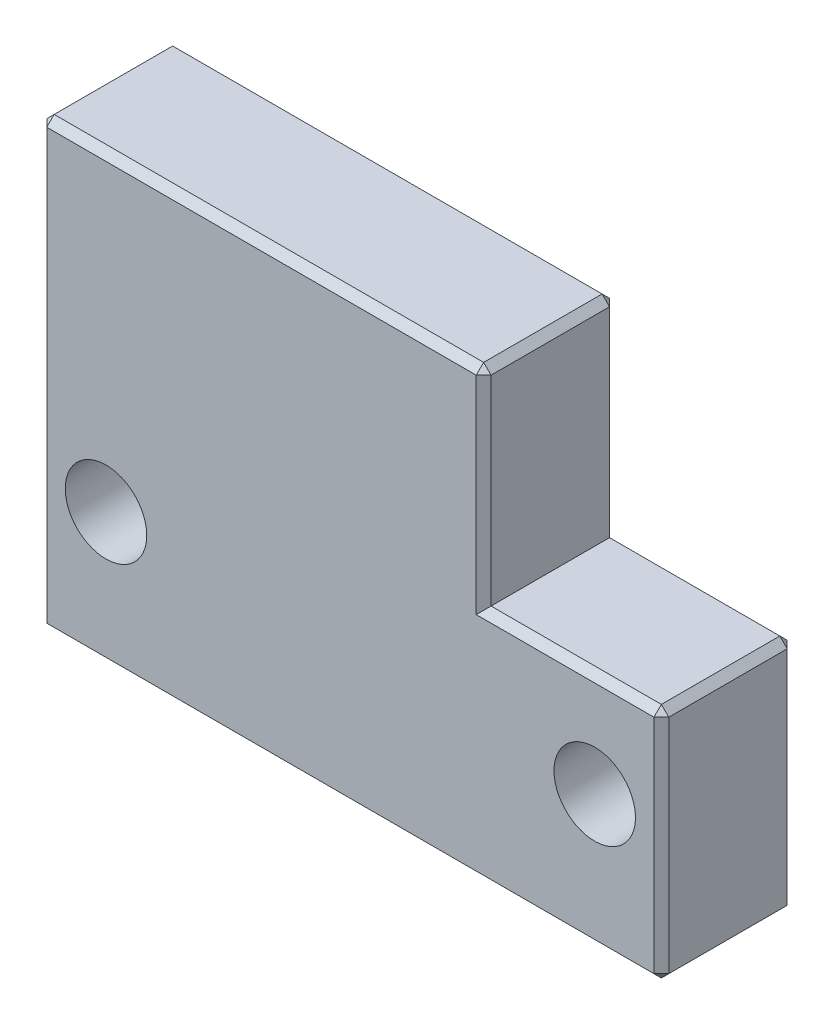
ISO-10303-21;
HEADER;
FILE_DESCRIPTION(('STEP AP214'),'2;1');
FILE_NAME('part.step','',(''),(''),'','','');
FILE_SCHEMA(('AUTOMOTIVE_DESIGN { 1 0 10303 214 1 1 1 1 }'));
ENDSEC;
DATA;
#1=APPLICATION_CONTEXT('core data for automotive mechanical design processes');
#2=APPLICATION_PROTOCOL_DEFINITION('international standard','automotive_design',2000,#1);
#3=PRODUCT_CONTEXT('',#1,'mechanical');
#4=PRODUCT('Part','Part','',(#3));
#5=PRODUCT_RELATED_PRODUCT_CATEGORY('part','',(#4));
#6=PRODUCT_DEFINITION_FORMATION('','',#4);
#7=PRODUCT_DEFINITION_CONTEXT('part definition',#1,'design');
#8=PRODUCT_DEFINITION('design','',#6,#7);
#9=PRODUCT_DEFINITION_SHAPE('','',#8);
#10=(LENGTH_UNIT() NAMED_UNIT(*) SI_UNIT(.MILLI.,.METRE.));
#11=(NAMED_UNIT(*) PLANE_ANGLE_UNIT() SI_UNIT($,.RADIAN.));
#12=(NAMED_UNIT(*) SI_UNIT($,.STERADIAN.) SOLID_ANGLE_UNIT());
#13=UNCERTAINTY_MEASURE_WITH_UNIT(LENGTH_MEASURE(1.E-05),#10,'distance_accuracy_value','');
#14=(GEOMETRIC_REPRESENTATION_CONTEXT(3) GLOBAL_UNCERTAINTY_ASSIGNED_CONTEXT((#13)) GLOBAL_UNIT_ASSIGNED_CONTEXT((#10,
#11,#12)) REPRESENTATION_CONTEXT('',''));
#15=CARTESIAN_POINT('',(0.,0.,0.));
#16=DIRECTION('',(0.,0.,1.));
#17=DIRECTION('',(1.,0.,0.));
#18=AXIS2_PLACEMENT_3D('',#15,#16,#17);
#19=CARTESIAN_POINT('',(0.,0.,9.));
#20=DIRECTION('',(1.,0.,0.));
#21=DIRECTION('',(0.,1.,0.));
#22=AXIS2_PLACEMENT_3D('',#19,#20,#21);
#23=PLANE('',#22);
#24=DIRECTION('',(0.,0.,-1.));
#25=VECTOR('',#24,1.);
#26=CARTESIAN_POINT('',(0.,29.5,9.));
#27=LINE('',#26,#25);
#28=CARTESIAN_POINT('',(0.,29.5,8.49999999999999));
#29=VERTEX_POINT('',#28);
#30=CARTESIAN_POINT('',(0.,29.5,0.500000000000007));
#31=VERTEX_POINT('',#30);
#32=EDGE_CURVE('E189',#29,#31,#27,.T.);
#33=ORIENTED_EDGE('',*,*,#32,.T.);
#34=DIRECTION('',(0.,-1.,0.));
#35=VECTOR('',#34,1.);
#36=CARTESIAN_POINT('',(0.,0.,0.500000000000007));
#37=LINE('',#36,#35);
#38=CARTESIAN_POINT('',(0.,0.500000000000007,0.500000000000007));
#39=VERTEX_POINT('',#38);
#40=EDGE_CURVE('E160',#31,#39,#37,.T.);
#41=ORIENTED_EDGE('',*,*,#40,.T.);
#42=DIRECTION('',(0.,0.,1.));
#43=VECTOR('',#42,1.);
#44=CARTESIAN_POINT('',(0.,0.500000000000007,9.));
#45=LINE('',#44,#43);
#46=CARTESIAN_POINT('',(0.,0.500000000000007,8.49999999999999));
#47=VERTEX_POINT('',#46);
#48=EDGE_CURVE('E179',#39,#47,#45,.T.);
#49=ORIENTED_EDGE('',*,*,#48,.T.);
#50=DIRECTION('',(0.,1.,0.));
#51=VECTOR('',#50,1.);
#52=CARTESIAN_POINT('',(0.,0.,8.49999999999999));
#53=LINE('',#52,#51);
#54=EDGE_CURVE('E185',#47,#29,#53,.T.);
#55=ORIENTED_EDGE('',*,*,#54,.T.);
#56=EDGE_LOOP('',(#33,#41,#49,#55));
#57=FACE_BOUND('',#56,.T.);
#58=ADVANCED_FACE('F36',(#57),#23,.F.);
#59=CARTESIAN_POINT('',(0.,0.,9.));
#60=DIRECTION('',(0.,1.,0.));
#61=DIRECTION('',(0.,0.,1.));
#62=AXIS2_PLACEMENT_3D('',#59,#60,#61);
#63=PLANE('',#62);
#64=DIRECTION('',(1.,0.,0.));
#65=VECTOR('',#64,1.);
#66=CARTESIAN_POINT('',(42.,0.,0.5));
#67=LINE('',#66,#65);
#68=CARTESIAN_POINT('',(0.5,0.,0.5));
#69=VERTEX_POINT('',#68);
#70=CARTESIAN_POINT('',(41.5,0.,0.5));
#71=VERTEX_POINT('',#70);
#72=EDGE_CURVE('E210',#69,#71,#67,.T.);
#73=ORIENTED_EDGE('',*,*,#72,.T.);
#74=DIRECTION('',(0.,0.,1.));
#75=VECTOR('',#74,1.);
#76=CARTESIAN_POINT('',(41.5,0.,9.));
#77=LINE('',#76,#75);
#78=CARTESIAN_POINT('',(41.5,0.,8.5));
#79=VERTEX_POINT('',#78);
#80=EDGE_CURVE('E213',#71,#79,#77,.T.);
#81=ORIENTED_EDGE('',*,*,#80,.T.);
#82=DIRECTION('',(-1.,0.,0.));
#83=VECTOR('',#82,1.);
#84=CARTESIAN_POINT('',(0.,0.,8.5));
#85=LINE('',#84,#83);
#86=CARTESIAN_POINT('',(0.5,0.,8.5));
#87=VERTEX_POINT('',#86);
#88=EDGE_CURVE('E208',#79,#87,#85,.T.);
#89=ORIENTED_EDGE('',*,*,#88,.T.);
#90=DIRECTION('',(0.,0.,-1.));
#91=VECTOR('',#90,1.);
#92=CARTESIAN_POINT('',(0.5,0.,9.));
#93=LINE('',#92,#91);
#94=EDGE_CURVE('E206',#87,#69,#93,.T.);
#95=ORIENTED_EDGE('',*,*,#94,.T.);
#96=EDGE_LOOP('',(#73,#81,#89,#95));
#97=FACE_BOUND('',#96,.T.);
#98=ADVANCED_FACE('F375',(#97),#63,.F.);
#99=CARTESIAN_POINT('',(42.,0.,9.));
#100=DIRECTION('',(-1.,0.,0.));
#101=DIRECTION('',(0.,-1.,0.));
#102=AXIS2_PLACEMENT_3D('',#99,#100,#101);
#103=PLANE('',#102);
#104=DIRECTION('',(0.,-1.,0.));
#105=VECTOR('',#104,1.);
#106=CARTESIAN_POINT('',(42.,0.,8.49999999999999));
#107=LINE('',#106,#105);
#108=CARTESIAN_POINT('',(42.,15.5,8.49999999999999));
#109=VERTEX_POINT('',#108);
#110=CARTESIAN_POINT('',(42.,0.500000000000007,8.49999999999999));
#111=VERTEX_POINT('',#110);
#112=EDGE_CURVE('E245',#109,#111,#107,.T.);
#113=ORIENTED_EDGE('',*,*,#112,.T.);
#114=DIRECTION('',(0.,0.,-1.));
#115=VECTOR('',#114,1.);
#116=CARTESIAN_POINT('',(42.,0.500000000000007,9.));
#117=LINE('',#116,#115);
#118=CARTESIAN_POINT('',(42.,0.500000000000007,0.5));
#119=VERTEX_POINT('',#118);
#120=EDGE_CURVE('E247',#111,#119,#117,.T.);
#121=ORIENTED_EDGE('',*,*,#120,.T.);
#122=DIRECTION('',(0.,1.,0.));
#123=VECTOR('',#122,1.);
#124=CARTESIAN_POINT('',(42.,16.,0.5));
#125=LINE('',#124,#123);
#126=CARTESIAN_POINT('',(42.,15.5,0.5));
#127=VERTEX_POINT('',#126);
#128=EDGE_CURVE('E243',#119,#127,#125,.T.);
#129=ORIENTED_EDGE('',*,*,#128,.T.);
#130=DIRECTION('',(0.,0.,1.));
#131=VECTOR('',#130,1.);
#132=CARTESIAN_POINT('',(42.,15.5,9.));
#133=LINE('',#132,#131);
#134=EDGE_CURVE('E241',#127,#109,#133,.T.);
#135=ORIENTED_EDGE('',*,*,#134,.T.);
#136=EDGE_LOOP('',(#113,#121,#129,#135));
#137=FACE_BOUND('',#136,.T.);
#138=ADVANCED_FACE('F400',(#137),#103,.F.);
#139=CARTESIAN_POINT('',(0.,30.,9.));
#140=DIRECTION('',(0.,-1.,0.));
#141=DIRECTION('',(0.,0.,-1.));
#142=AXIS2_PLACEMENT_3D('',#139,#140,#141);
#143=PLANE('',#142);
#144=DIRECTION('',(-1.,0.,0.));
#145=VECTOR('',#144,1.);
#146=CARTESIAN_POINT('',(0.,30.,0.5));
#147=LINE('',#146,#145);
#148=CARTESIAN_POINT('',(29.5,30.,0.5));
#149=VERTEX_POINT('',#148);
#150=CARTESIAN_POINT('',(0.499999999999994,30.,0.5));
#151=VERTEX_POINT('',#150);
#152=EDGE_CURVE('E45',#149,#151,#147,.T.);
#153=ORIENTED_EDGE('',*,*,#152,.T.);
#154=DIRECTION('',(0.,0.,1.));
#155=VECTOR('',#154,1.);
#156=CARTESIAN_POINT('',(0.499999999999994,30.,9.));
#157=LINE('',#156,#155);
#158=CARTESIAN_POINT('',(0.499999999999994,30.,8.49999999999999));
#159=VERTEX_POINT('',#158);
#160=EDGE_CURVE('E11',#151,#159,#157,.T.);
#161=ORIENTED_EDGE('',*,*,#160,.T.);
#162=DIRECTION('',(1.,0.,0.));
#163=VECTOR('',#162,1.);
#164=CARTESIAN_POINT('',(0.,30.,8.49999999999999));
#165=LINE('',#164,#163);
#166=CARTESIAN_POINT('',(29.5,30.,8.49999999999999));
#167=VERTEX_POINT('',#166);
#168=EDGE_CURVE('E250',#159,#167,#165,.T.);
#169=ORIENTED_EDGE('',*,*,#168,.T.);
#170=DIRECTION('',(0.,0.,-1.));
#171=VECTOR('',#170,1.);
#172=CARTESIAN_POINT('',(29.5,30.,9.));
#173=LINE('',#172,#171);
#174=EDGE_CURVE('E56',#167,#149,#173,.T.);
#175=ORIENTED_EDGE('',*,*,#174,.T.);
#176=EDGE_LOOP('',(#153,#161,#169,#175));
#177=FACE_BOUND('',#176,.T.);
#178=ADVANCED_FACE('F491',(#177),#143,.F.);
#179=CARTESIAN_POINT('',(0.,30.,9.));
#180=DIRECTION('',(0.,0.,-1.));
#181=DIRECTION('',(-1.,0.,0.));
#182=AXIS2_PLACEMENT_3D('',#179,#180,#181);
#183=PLANE('',#182);
#184=CARTESIAN_POINT('',(4.49999999999999,8.99999999999999,9.));
#185=DIRECTION('',(0.,0.,-1.));
#186=DIRECTION('',(-1.,0.,0.));
#187=AXIS2_PLACEMENT_3D('',#184,#185,#186);
#188=CIRCLE('',#187,2.75);
#189=CARTESIAN_POINT('',(1.74999999999999,8.99999999999999,9.));
#190=VERTEX_POINT('',#189);
#191=EDGE_CURVE('E810',#190,#190,#188,.T.);
#192=ORIENTED_EDGE('',*,*,#191,.T.);
#193=EDGE_LOOP('',(#192));
#194=FACE_BOUND('',#193,.T.);
#195=CARTESIAN_POINT('',(37.5,9.00000000000002,9.));
#196=DIRECTION('',(0.,0.,-1.));
#197=DIRECTION('',(-1.,0.,0.));
#198=AXIS2_PLACEMENT_3D('',#195,#196,#197);
#199=CIRCLE('',#198,2.75);
#200=CARTESIAN_POINT('',(34.75,9.00000000000002,9.));
#201=VERTEX_POINT('',#200);
#202=EDGE_CURVE('E166',#201,#201,#199,.T.);
#203=ORIENTED_EDGE('',*,*,#202,.T.);
#204=EDGE_LOOP('',(#203));
#205=FACE_BOUND('',#204,.T.);
#206=DIRECTION('',(0.,-1.,0.));
#207=VECTOR('',#206,1.);
#208=CARTESIAN_POINT('',(0.499999999999994,30.,9.));
#209=LINE('',#208,#207);
#210=CARTESIAN_POINT('',(0.499999999999994,29.5,9.));
#211=VERTEX_POINT('',#210);
#212=CARTESIAN_POINT('',(0.5,0.500000000000007,9.));
#213=VERTEX_POINT('',#212);
#214=EDGE_CURVE('E228',#211,#213,#209,.T.);
#215=ORIENTED_EDGE('',*,*,#214,.T.);
#216=DIRECTION('',(1.,0.,0.));
#217=VECTOR('',#216,1.);
#218=CARTESIAN_POINT('',(0.,0.500000000000007,9.));
#219=LINE('',#218,#217);
#220=CARTESIAN_POINT('',(41.5,0.500000000000007,9.));
#221=VERTEX_POINT('',#220);
#222=EDGE_CURVE('E238',#213,#221,#219,.T.);
#223=ORIENTED_EDGE('',*,*,#222,.T.);
#224=DIRECTION('',(0.,1.,0.));
#225=VECTOR('',#224,1.);
#226=CARTESIAN_POINT('',(41.5,30.,9.));
#227=LINE('',#226,#225);
#228=CARTESIAN_POINT('',(41.5,15.5,9.));
#229=VERTEX_POINT('',#228);
#230=EDGE_CURVE('E236',#221,#229,#227,.T.);
#231=ORIENTED_EDGE('',*,*,#230,.T.);
#232=DIRECTION('',(-1.,0.,0.));
#233=VECTOR('',#232,1.);
#234=CARTESIAN_POINT('',(0.,15.5,9.));
#235=LINE('',#234,#233);
#236=CARTESIAN_POINT('',(29.5,15.5,9.));
#237=VERTEX_POINT('',#236);
#238=EDGE_CURVE('E234',#229,#237,#235,.T.);
#239=ORIENTED_EDGE('',*,*,#238,.T.);
#240=DIRECTION('',(0.,1.,0.));
#241=VECTOR('',#240,1.);
#242=CARTESIAN_POINT('',(29.5,30.,9.));
#243=LINE('',#242,#241);
#244=CARTESIAN_POINT('',(29.5,29.5,9.));
#245=VERTEX_POINT('',#244);
#246=EDGE_CURVE('E232',#237,#245,#243,.T.);
#247=ORIENTED_EDGE('',*,*,#246,.T.);
#248=DIRECTION('',(-1.,0.,0.));
#249=VECTOR('',#248,1.);
#250=CARTESIAN_POINT('',(0.,29.5,9.));
#251=LINE('',#250,#249);
#252=EDGE_CURVE('E230',#245,#211,#251,.T.);
#253=ORIENTED_EDGE('',*,*,#252,.T.);
#254=EDGE_LOOP('',(#215,#223,#231,#239,#247,#253));
#255=FACE_BOUND('',#254,.T.);
#256=ADVANCED_FACE('F479',(#194,#205,#255),#183,.F.);
#257=CARTESIAN_POINT('',(0.,30.,0.));
#258=DIRECTION('',(0.,0.,-1.));
#259=DIRECTION('',(-1.,0.,0.));
#260=AXIS2_PLACEMENT_3D('',#257,#258,#259);
#261=PLANE('',#260);
#262=CARTESIAN_POINT('',(4.49999999999999,8.99999999999999,0.));
#263=DIRECTION('',(0.,0.,-1.));
#264=DIRECTION('',(-1.,0.,0.));
#265=AXIS2_PLACEMENT_3D('',#262,#263,#264);
#266=CIRCLE('',#265,2.75);
#267=CARTESIAN_POINT('',(1.74999999999999,8.99999999999999,0.));
#268=VERTEX_POINT('',#267);
#269=EDGE_CURVE('E815',#268,#268,#266,.T.);
#270=ORIENTED_EDGE('',*,*,#269,.F.);
#271=EDGE_LOOP('',(#270));
#272=FACE_BOUND('',#271,.T.);
#273=CARTESIAN_POINT('',(37.5,9.00000000000002,0.));
#274=DIRECTION('',(0.,0.,-1.));
#275=DIRECTION('',(-1.,0.,0.));
#276=AXIS2_PLACEMENT_3D('',#273,#274,#275);
#277=CIRCLE('',#276,2.75);
#278=CARTESIAN_POINT('',(34.75,9.00000000000002,0.));
#279=VERTEX_POINT('',#278);
#280=EDGE_CURVE('E342',#279,#279,#277,.T.);
#281=ORIENTED_EDGE('',*,*,#280,.F.);
#282=EDGE_LOOP('',(#281));
#283=FACE_BOUND('',#282,.T.);
#284=DIRECTION('',(0.,-1.,0.));
#285=VECTOR('',#284,1.);
#286=CARTESIAN_POINT('',(41.5,0.,0.));
#287=LINE('',#286,#285);
#288=CARTESIAN_POINT('',(41.5,15.5,0.));
#289=VERTEX_POINT('',#288);
#290=CARTESIAN_POINT('',(41.5,0.500000000000007,0.));
#291=VERTEX_POINT('',#290);
#292=EDGE_CURVE('E202',#289,#291,#287,.T.);
#293=ORIENTED_EDGE('',*,*,#292,.T.);
#294=DIRECTION('',(-1.,0.,0.));
#295=VECTOR('',#294,1.);
#296=CARTESIAN_POINT('',(0.,0.500000000000007,0.));
#297=LINE('',#296,#295);
#298=CARTESIAN_POINT('',(0.5,0.500000000000007,0.));
#299=VERTEX_POINT('',#298);
#300=EDGE_CURVE('E204',#291,#299,#297,.T.);
#301=ORIENTED_EDGE('',*,*,#300,.T.);
#302=DIRECTION('',(0.,1.,0.));
#303=VECTOR('',#302,1.);
#304=CARTESIAN_POINT('',(0.499999999999993,30.,0.));
#305=LINE('',#304,#303);
#306=CARTESIAN_POINT('',(0.499999999999994,29.5,0.));
#307=VERTEX_POINT('',#306);
#308=EDGE_CURVE('E162',#299,#307,#305,.T.);
#309=ORIENTED_EDGE('',*,*,#308,.T.);
#310=DIRECTION('',(1.,0.,0.));
#311=VECTOR('',#310,1.);
#312=CARTESIAN_POINT('',(30.,29.5,0.));
#313=LINE('',#312,#311);
#314=CARTESIAN_POINT('',(29.5,29.5,0.));
#315=VERTEX_POINT('',#314);
#316=EDGE_CURVE('E191',#307,#315,#313,.T.);
#317=ORIENTED_EDGE('',*,*,#316,.T.);
#318=DIRECTION('',(0.,-1.,0.));
#319=VECTOR('',#318,1.);
#320=CARTESIAN_POINT('',(29.5,16.,0.));
#321=LINE('',#320,#319);
#322=CARTESIAN_POINT('',(29.5,15.5,0.));
#323=VERTEX_POINT('',#322);
#324=EDGE_CURVE('E193',#315,#323,#321,.T.);
#325=ORIENTED_EDGE('',*,*,#324,.T.);
#326=DIRECTION('',(1.,0.,0.));
#327=VECTOR('',#326,1.);
#328=CARTESIAN_POINT('',(42.,15.5,0.));
#329=LINE('',#328,#327);
#330=EDGE_CURVE('E199',#323,#289,#329,.T.);
#331=ORIENTED_EDGE('',*,*,#330,.T.);
#332=EDGE_LOOP('',(#293,#301,#309,#317,#325,#331));
#333=FACE_BOUND('',#332,.T.);
#334=ADVANCED_FACE('F366',(#272,#283,#333),#261,.T.);
#335=CARTESIAN_POINT('',(30.,30.,9.));
#336=DIRECTION('',(-1.,0.,0.));
#337=DIRECTION('',(0.,-1.,0.));
#338=AXIS2_PLACEMENT_3D('',#335,#336,#337);
#339=PLANE('',#338);
#340=DIRECTION('',(0.,0.,-1.));
#341=VECTOR('',#340,1.);
#342=CARTESIAN_POINT('',(30.,16.,9.));
#343=LINE('',#342,#341);
#344=CARTESIAN_POINT('',(30.,16.,8.49999999999999));
#345=VERTEX_POINT('',#344);
#346=CARTESIAN_POINT('',(30.,16.,0.5));
#347=VERTEX_POINT('',#346);
#348=EDGE_CURVE('E186',#345,#347,#343,.T.);
#349=ORIENTED_EDGE('',*,*,#348,.T.);
#350=DIRECTION('',(0.,1.,0.));
#351=VECTOR('',#350,1.);
#352=CARTESIAN_POINT('',(30.,30.,0.5));
#353=LINE('',#352,#351);
#354=CARTESIAN_POINT('',(30.,29.5,0.5));
#355=VERTEX_POINT('',#354);
#356=EDGE_CURVE('E226',#347,#355,#353,.T.);
#357=ORIENTED_EDGE('',*,*,#356,.T.);
#358=DIRECTION('',(0.,0.,1.));
#359=VECTOR('',#358,1.);
#360=CARTESIAN_POINT('',(30.,29.5,9.));
#361=LINE('',#360,#359);
#362=CARTESIAN_POINT('',(30.,29.5,8.49999999999999));
#363=VERTEX_POINT('',#362);
#364=EDGE_CURVE('E222',#355,#363,#361,.T.);
#365=ORIENTED_EDGE('',*,*,#364,.T.);
#366=DIRECTION('',(0.,-1.,0.));
#367=VECTOR('',#366,1.);
#368=CARTESIAN_POINT('',(30.,30.,8.49999999999999));
#369=LINE('',#368,#367);
#370=EDGE_CURVE('E224',#363,#345,#369,.T.);
#371=ORIENTED_EDGE('',*,*,#370,.T.);
#372=EDGE_LOOP('',(#349,#357,#365,#371));
#373=FACE_BOUND('',#372,.T.);
#374=ADVANCED_FACE('F478',(#373),#339,.F.);
#375=CARTESIAN_POINT('',(42.,16.,9.));
#376=DIRECTION('',(0.,-1.,0.));
#377=DIRECTION('',(0.,0.,-1.));
#378=AXIS2_PLACEMENT_3D('',#375,#376,#377);
#379=PLANE('',#378);
#380=DIRECTION('',(0.,0.,-1.));
#381=VECTOR('',#380,1.);
#382=CARTESIAN_POINT('',(41.5,16.,9.));
#383=LINE('',#382,#381);
#384=CARTESIAN_POINT('',(41.5,16.,8.49999999999999));
#385=VERTEX_POINT('',#384);
#386=CARTESIAN_POINT('',(41.5,16.,0.5));
#387=VERTEX_POINT('',#386);
#388=EDGE_CURVE('E217',#385,#387,#383,.T.);
#389=ORIENTED_EDGE('',*,*,#388,.T.);
#390=DIRECTION('',(-1.,0.,0.));
#391=VECTOR('',#390,1.);
#392=CARTESIAN_POINT('',(30.,16.,0.5));
#393=LINE('',#392,#391);
#394=EDGE_CURVE('E219',#387,#347,#393,.T.);
#395=ORIENTED_EDGE('',*,*,#394,.T.);
#396=ORIENTED_EDGE('',*,*,#348,.F.);
#397=DIRECTION('',(1.,0.,0.));
#398=VECTOR('',#397,1.);
#399=CARTESIAN_POINT('',(42.,16.,8.49999999999999));
#400=LINE('',#399,#398);
#401=EDGE_CURVE('E215',#345,#385,#400,.T.);
#402=ORIENTED_EDGE('',*,*,#401,.T.);
#403=EDGE_LOOP('',(#389,#395,#396,#402));
#404=FACE_BOUND('',#403,.T.);
#405=ADVANCED_FACE('F717',(#404),#379,.F.);
#406=CARTESIAN_POINT('',(0.,15.5,9.));
#407=DIRECTION('',(0.,-0.707106781186552,-0.707106781186542));
#408=DIRECTION('',(0.,0.707106781186543,-0.707106781186552));
#409=AXIS2_PLACEMENT_3D('',#406,#407,#408);
#410=PLANE('',#409);
#411=DIRECTION('',(0.,0.707106781186543,-0.707106781186552));
#412=VECTOR('',#411,1.);
#413=CARTESIAN_POINT('',(41.5,15.5,9.));
#414=LINE('',#413,#412);
#415=EDGE_CURVE('E40',#385,#229,#414,.F.);
#416=ORIENTED_EDGE('',*,*,#415,.F.);
#417=ORIENTED_EDGE('',*,*,#401,.F.);
#418=DIRECTION('',(0.577350269189623,0.577350269189623,-0.577350269189631));
#419=VECTOR('',#418,1.);
#420=CARTESIAN_POINT('',(19.6666666666667,5.66666666666676,18.8333333333334));
#421=LINE('',#420,#419);
#422=EDGE_CURVE('E326',#237,#345,#421,.T.);
#423=ORIENTED_EDGE('',*,*,#422,.F.);
#424=ORIENTED_EDGE('',*,*,#238,.F.);
#425=EDGE_LOOP('',(#416,#417,#423,#424));
#426=FACE_BOUND('',#425,.T.);
#427=ADVANCED_FACE('F38',(#426),#410,.F.);
#428=CARTESIAN_POINT('',(41.5,15.5,9.));
#429=DIRECTION('',(0.577350269189636,0.577350269189625,0.577350269189617));
#430=DIRECTION('',(-0.70710678118654,0.707106781186555,0.));
#431=AXIS2_PLACEMENT_3D('',#428,#429,#430);
#432=PLANE('',#431);
#433=DIRECTION('',(0.707106781186543,-0.707106781186553,0.));
#434=VECTOR('',#433,1.);
#435=CARTESIAN_POINT('',(41.75,15.75,8.49999999999999));
#436=LINE('',#435,#434);
#437=EDGE_CURVE('E321',#385,#109,#436,.T.);
#438=ORIENTED_EDGE('',*,*,#437,.F.);
#439=ORIENTED_EDGE('',*,*,#415,.T.);
#440=DIRECTION('',(-0.707106781186542,0.,0.707106781186552));
#441=VECTOR('',#440,1.);
#442=CARTESIAN_POINT('',(41.5,15.5,9.));
#443=LINE('',#442,#441);
#444=EDGE_CURVE('E324',#109,#229,#443,.T.);
#445=ORIENTED_EDGE('',*,*,#444,.F.);
#446=EDGE_LOOP('',(#438,#439,#445));
#447=FACE_BOUND('',#446,.T.);
#448=ADVANCED_FACE('F700',(#447),#432,.T.);
#449=CARTESIAN_POINT('',(29.5,30.,9.));
#450=DIRECTION('',(-0.707106781186552,0.,-0.707106781186542));
#451=DIRECTION('',(-0.707106781186543,0.,0.707106781186552));
#452=AXIS2_PLACEMENT_3D('',#449,#450,#451);
#453=PLANE('',#452);
#454=ORIENTED_EDGE('',*,*,#422,.T.);
#455=ORIENTED_EDGE('',*,*,#370,.F.);
#456=DIRECTION('',(-0.707106781186543,0.,0.707106781186552));
#457=VECTOR('',#456,1.);
#458=CARTESIAN_POINT('',(29.5,29.5,9.));
#459=LINE('',#458,#457);
#460=EDGE_CURVE('E318',#245,#363,#459,.F.);
#461=ORIENTED_EDGE('',*,*,#460,.F.);
#462=ORIENTED_EDGE('',*,*,#246,.F.);
#463=EDGE_LOOP('',(#454,#455,#461,#462));
#464=FACE_BOUND('',#463,.T.);
#465=ADVANCED_FACE('F689',(#464),#453,.F.);
#466=CARTESIAN_POINT('',(41.5,30.,9.));
#467=DIRECTION('',(-0.707106781186552,0.,-0.707106781186542));
#468=DIRECTION('',(-0.707106781186543,0.,0.707106781186552));
#469=AXIS2_PLACEMENT_3D('',#466,#467,#468);
#470=PLANE('',#469);
#471=ORIENTED_EDGE('',*,*,#444,.T.);
#472=ORIENTED_EDGE('',*,*,#230,.F.);
#473=DIRECTION('',(0.707106781186542,0.,-0.707106781186552));
#474=VECTOR('',#473,1.);
#475=CARTESIAN_POINT('',(41.5,0.500000000000007,9.));
#476=LINE('',#475,#474);
#477=EDGE_CURVE('E315',#111,#221,#476,.F.);
#478=ORIENTED_EDGE('',*,*,#477,.F.);
#479=ORIENTED_EDGE('',*,*,#112,.F.);
#480=EDGE_LOOP('',(#471,#472,#478,#479));
#481=FACE_BOUND('',#480,.T.);
#482=ADVANCED_FACE('F678',(#481),#470,.F.);
#483=CARTESIAN_POINT('',(41.5,16.,9.));
#484=DIRECTION('',(-0.707106781186552,-0.707106781186542,0.));
#485=DIRECTION('',(0.707106781186543,-0.707106781186552,0.));
#486=AXIS2_PLACEMENT_3D('',#483,#484,#485);
#487=PLANE('',#486);
#488=ORIENTED_EDGE('',*,*,#437,.T.);
#489=ORIENTED_EDGE('',*,*,#134,.F.);
#490=DIRECTION('',(-0.707106781186543,0.707106781186552,0.));
#491=VECTOR('',#490,1.);
#492=CARTESIAN_POINT('',(41.75,15.75,0.500000000000002));
#493=LINE('',#492,#491);
#494=EDGE_CURVE('E312',#387,#127,#493,.F.);
#495=ORIENTED_EDGE('',*,*,#494,.F.);
#496=ORIENTED_EDGE('',*,*,#388,.F.);
#497=EDGE_LOOP('',(#488,#489,#495,#496));
#498=FACE_BOUND('',#497,.T.);
#499=ADVANCED_FACE('F667',(#498),#487,.F.);
#500=CARTESIAN_POINT('',(42.,16.,0.5));
#501=DIRECTION('',(0.,0.707106781186542,-0.707106781186552));
#502=DIRECTION('',(0.,0.707106781186552,0.707106781186543));
#503=AXIS2_PLACEMENT_3D('',#500,#501,#502);
#504=PLANE('',#503);
#505=DIRECTION('',(-0.577350269189629,-0.577350269189628,-0.57735026918962));
#506=VECTOR('',#505,1.);
#507=CARTESIAN_POINT('',(34.,20.,4.49999999999998));
#508=LINE('',#507,#506);
#509=EDGE_CURVE('E306',#347,#323,#508,.T.);
#510=ORIENTED_EDGE('',*,*,#509,.F.);
#511=ORIENTED_EDGE('',*,*,#394,.F.);
#512=DIRECTION('',(0.,0.707106781186552,0.707106781186543));
#513=VECTOR('',#512,1.);
#514=CARTESIAN_POINT('',(41.5,15.5,0.));
#515=LINE('',#514,#513);
#516=EDGE_CURVE('E309',#289,#387,#515,.T.);
#517=ORIENTED_EDGE('',*,*,#516,.F.);
#518=ORIENTED_EDGE('',*,*,#330,.F.);
#519=EDGE_LOOP('',(#510,#511,#517,#518));
#520=FACE_BOUND('',#519,.T.);
#521=ADVANCED_FACE('F656',(#520),#504,.T.);
#522=CARTESIAN_POINT('',(29.5,29.5,9.));
#523=DIRECTION('',(0.577350269189634,0.577350269189626,0.577350269189618));
#524=DIRECTION('',(-0.707106781186543,0.707106781186552,0.));
#525=AXIS2_PLACEMENT_3D('',#522,#523,#524);
#526=PLANE('',#525);
#527=DIRECTION('',(0.,0.707106781186543,-0.707106781186552));
#528=VECTOR('',#527,1.);
#529=CARTESIAN_POINT('',(29.5,29.5,9.));
#530=LINE('',#529,#528);
#531=EDGE_CURVE('E300',#245,#167,#530,.T.);
#532=ORIENTED_EDGE('',*,*,#531,.F.);
#533=ORIENTED_EDGE('',*,*,#460,.T.);
#534=DIRECTION('',(0.707106781186543,-0.707106781186552,0.));
#535=VECTOR('',#534,1.);
#536=CARTESIAN_POINT('',(29.75,29.75,8.49999999999999));
#537=LINE('',#536,#535);
#538=EDGE_CURVE('E303',#167,#363,#537,.T.);
#539=ORIENTED_EDGE('',*,*,#538,.F.);
#540=EDGE_LOOP('',(#532,#533,#539));
#541=FACE_BOUND('',#540,.T.);
#542=ADVANCED_FACE('F645',(#541),#526,.T.);
#543=CARTESIAN_POINT('',(41.5,0.500000000000007,9.));
#544=DIRECTION('',(0.577350269189634,-0.577350269189618,0.577350269189626));
#545=DIRECTION('',(0.707106781186542,0.,-0.707106781186552));
#546=AXIS2_PLACEMENT_3D('',#543,#544,#545);
#547=PLANE('',#546);
#548=DIRECTION('',(-0.707106781186542,-0.707106781186553,0.));
#549=VECTOR('',#548,1.);
#550=CARTESIAN_POINT('',(41.75,0.250000000000004,8.49999999999999));
#551=LINE('',#550,#549);
#552=EDGE_CURVE('E295',#111,#79,#551,.T.);
#553=ORIENTED_EDGE('',*,*,#552,.F.);
#554=ORIENTED_EDGE('',*,*,#477,.T.);
#555=DIRECTION('',(0.,0.707106781186552,0.707106781186543));
#556=VECTOR('',#555,1.);
#557=CARTESIAN_POINT('',(41.5,0.500000000000007,9.));
#558=LINE('',#557,#556);
#559=EDGE_CURVE('E298',#79,#221,#558,.T.);
#560=ORIENTED_EDGE('',*,*,#559,.F.);
#561=EDGE_LOOP('',(#553,#554,#560));
#562=FACE_BOUND('',#561,.T.);
#563=ADVANCED_FACE('F634',(#562),#547,.T.);
#564=CARTESIAN_POINT('',(41.5,15.5,0.));
#565=DIRECTION('',(0.577350269189629,0.577350269189616,-0.577350269189633));
#566=DIRECTION('',(-0.70710678118655,0.,-0.707106781186545));
#567=AXIS2_PLACEMENT_3D('',#564,#565,#566);
#568=PLANE('',#567);
#569=ORIENTED_EDGE('',*,*,#516,.T.);
#570=ORIENTED_EDGE('',*,*,#494,.T.);
#571=DIRECTION('',(-0.707106781186552,0.,-0.707106781186543));
#572=VECTOR('',#571,1.);
#573=CARTESIAN_POINT('',(41.5,15.5,0.));
#574=LINE('',#573,#572);
#575=EDGE_CURVE('E292',#289,#127,#574,.F.);
#576=ORIENTED_EDGE('',*,*,#575,.F.);
#577=EDGE_LOOP('',(#569,#570,#576));
#578=FACE_BOUND('',#577,.T.);
#579=ADVANCED_FACE('F623',(#578),#568,.T.);
#580=CARTESIAN_POINT('',(30.,30.,0.5));
#581=DIRECTION('',(0.707106781186542,0.,-0.707106781186552));
#582=DIRECTION('',(-0.707106781186552,0.,-0.707106781186543));
#583=AXIS2_PLACEMENT_3D('',#580,#581,#582);
#584=PLANE('',#583);
#585=ORIENTED_EDGE('',*,*,#509,.T.);
#586=ORIENTED_EDGE('',*,*,#324,.F.);
#587=DIRECTION('',(-0.707106781186552,0.,-0.707106781186543));
#588=VECTOR('',#587,1.);
#589=CARTESIAN_POINT('',(30.,29.5,0.500000000000001));
#590=LINE('',#589,#588);
#591=EDGE_CURVE('E289',#355,#315,#590,.T.);
#592=ORIENTED_EDGE('',*,*,#591,.F.);
#593=ORIENTED_EDGE('',*,*,#356,.F.);
#594=EDGE_LOOP('',(#585,#586,#592,#593));
#595=FACE_BOUND('',#594,.T.);
#596=ADVANCED_FACE('F612',(#595),#584,.T.);
#597=CARTESIAN_POINT('',(29.5,30.,9.));
#598=DIRECTION('',(-0.707106781186552,-0.707106781186542,0.));
#599=DIRECTION('',(0.707106781186543,-0.707106781186552,0.));
#600=AXIS2_PLACEMENT_3D('',#597,#598,#599);
#601=PLANE('',#600);
#602=ORIENTED_EDGE('',*,*,#538,.T.);
#603=ORIENTED_EDGE('',*,*,#364,.F.);
#604=DIRECTION('',(-0.707106781186543,0.707106781186552,0.));
#605=VECTOR('',#604,1.);
#606=CARTESIAN_POINT('',(30.,29.5,0.5));
#607=LINE('',#606,#605);
#608=EDGE_CURVE('E286',#149,#355,#607,.F.);
#609=ORIENTED_EDGE('',*,*,#608,.F.);
#610=ORIENTED_EDGE('',*,*,#174,.F.);
#611=EDGE_LOOP('',(#602,#603,#609,#610));
#612=FACE_BOUND('',#611,.T.);
#613=ADVANCED_FACE('F601',(#612),#601,.F.);
#614=CARTESIAN_POINT('',(0.,29.5,9.));
#615=DIRECTION('',(0.,-0.707106781186552,-0.707106781186542));
#616=DIRECTION('',(0.,0.707106781186543,-0.707106781186552));
#617=AXIS2_PLACEMENT_3D('',#614,#615,#616);
#618=PLANE('',#617);
#619=ORIENTED_EDGE('',*,*,#531,.T.);
#620=ORIENTED_EDGE('',*,*,#168,.F.);
#621=DIRECTION('',(0.,-0.707106781186543,0.707106781186552));
#622=VECTOR('',#621,1.);
#623=CARTESIAN_POINT('',(0.499999999999994,30.,8.49999999999999));
#624=LINE('',#623,#622);
#625=EDGE_CURVE('E283',#211,#159,#624,.F.);
#626=ORIENTED_EDGE('',*,*,#625,.F.);
#627=ORIENTED_EDGE('',*,*,#252,.F.);
#628=EDGE_LOOP('',(#619,#620,#626,#627));
#629=FACE_BOUND('',#628,.T.);
#630=ADVANCED_FACE('F591',(#629),#618,.F.);
#631=CARTESIAN_POINT('',(0.499999999999994,30.,9.));
#632=DIRECTION('',(0.707106781186552,0.,-0.707106781186542));
#633=DIRECTION('',(-0.707106781186543,0.,-0.707106781186552));
#634=AXIS2_PLACEMENT_3D('',#631,#632,#633);
#635=PLANE('',#634);
#636=DIRECTION('',(0.707106781186543,0.,0.707106781186552));
#637=VECTOR('',#636,1.);
#638=CARTESIAN_POINT('',(0.25,0.500000000000007,8.75));
#639=LINE('',#638,#637);
#640=EDGE_CURVE('E277',#213,#47,#639,.F.);
#641=ORIENTED_EDGE('',*,*,#640,.F.);
#642=ORIENTED_EDGE('',*,*,#214,.F.);
#643=DIRECTION('',(-0.707106781186542,0.,-0.707106781186552));
#644=VECTOR('',#643,1.);
#645=CARTESIAN_POINT('',(0.249999999999993,29.5,8.75));
#646=LINE('',#645,#644);
#647=EDGE_CURVE('E280',#29,#211,#646,.F.);
#648=ORIENTED_EDGE('',*,*,#647,.F.);
#649=ORIENTED_EDGE('',*,*,#54,.F.);
#650=EDGE_LOOP('',(#641,#642,#648,#649));
#651=FACE_BOUND('',#650,.T.);
#652=ADVANCED_FACE('F349',(#651),#635,.F.);
#653=CARTESIAN_POINT('',(0.,0.500000000000007,9.));
#654=DIRECTION('',(0.,0.707106781186542,-0.707106781186552));
#655=DIRECTION('',(0.,0.707106781186552,0.707106781186543));
#656=AXIS2_PLACEMENT_3D('',#653,#654,#655);
#657=PLANE('',#656);
#658=ORIENTED_EDGE('',*,*,#559,.T.);
#659=ORIENTED_EDGE('',*,*,#222,.F.);
#660=DIRECTION('',(0.,-0.707106781186552,-0.707106781186543));
#661=VECTOR('',#660,1.);
#662=CARTESIAN_POINT('',(0.5,0.,8.5));
#663=LINE('',#662,#661);
#664=EDGE_CURVE('E274',#87,#213,#663,.F.);
#665=ORIENTED_EDGE('',*,*,#664,.F.);
#666=ORIENTED_EDGE('',*,*,#88,.F.);
#667=EDGE_LOOP('',(#658,#659,#665,#666));
#668=FACE_BOUND('',#667,.T.);
#669=ADVANCED_FACE('F381',(#668),#657,.F.);
#670=CARTESIAN_POINT('',(42.,0.500000000000008,9.));
#671=DIRECTION('',(-0.707106781186552,0.707106781186542,0.));
#672=DIRECTION('',(-0.707106781186542,-0.707106781186553,0.));
#673=AXIS2_PLACEMENT_3D('',#670,#671,#672);
#674=PLANE('',#673);
#675=ORIENTED_EDGE('',*,*,#552,.T.);
#676=ORIENTED_EDGE('',*,*,#80,.F.);
#677=DIRECTION('',(0.707106781186542,0.707106781186553,0.));
#678=VECTOR('',#677,1.);
#679=CARTESIAN_POINT('',(41.5,0.,0.5));
#680=LINE('',#679,#678);
#681=EDGE_CURVE('E271',#119,#71,#680,.F.);
#682=ORIENTED_EDGE('',*,*,#681,.F.);
#683=ORIENTED_EDGE('',*,*,#120,.F.);
#684=EDGE_LOOP('',(#675,#676,#682,#683));
#685=FACE_BOUND('',#684,.T.);
#686=ADVANCED_FACE('F561',(#685),#674,.F.);
#687=CARTESIAN_POINT('',(42.,0.,0.5));
#688=DIRECTION('',(0.707106781186542,0.,-0.707106781186552));
#689=DIRECTION('',(-0.707106781186552,0.,-0.707106781186543));
#690=AXIS2_PLACEMENT_3D('',#687,#688,#689);
#691=PLANE('',#690);
#692=ORIENTED_EDGE('',*,*,#575,.T.);
#693=ORIENTED_EDGE('',*,*,#128,.F.);
#694=DIRECTION('',(0.707106781186552,0.,0.707106781186542));
#695=VECTOR('',#694,1.);
#696=CARTESIAN_POINT('',(41.75,0.500000000000007,0.25));
#697=LINE('',#696,#695);
#698=EDGE_CURVE('E269',#291,#119,#697,.T.);
#699=ORIENTED_EDGE('',*,*,#698,.F.);
#700=ORIENTED_EDGE('',*,*,#292,.F.);
#701=EDGE_LOOP('',(#692,#693,#699,#700));
#702=FACE_BOUND('',#701,.T.);
#703=ADVANCED_FACE('F550',(#702),#691,.T.);
#704=CARTESIAN_POINT('',(30.,29.5,0.5));
#705=DIRECTION('',(0.577350269189626,0.577350269189618,-0.577350269189634));
#706=DIRECTION('',(-0.707106781186552,0.,-0.707106781186543));
#707=AXIS2_PLACEMENT_3D('',#704,#705,#706);
#708=PLANE('',#707);
#709=ORIENTED_EDGE('',*,*,#608,.T.);
#710=ORIENTED_EDGE('',*,*,#591,.T.);
#711=DIRECTION('',(0.,0.707106781186552,0.707106781186543));
#712=VECTOR('',#711,1.);
#713=CARTESIAN_POINT('',(29.5,29.75,0.25));
#714=LINE('',#713,#712);
#715=EDGE_CURVE('E266',#149,#315,#714,.F.);
#716=ORIENTED_EDGE('',*,*,#715,.F.);
#717=EDGE_LOOP('',(#709,#710,#716));
#718=FACE_BOUND('',#717,.T.);
#719=ADVANCED_FACE('F393',(#718),#708,.T.);
#720=CARTESIAN_POINT('',(0.499999999999994,30.,8.49999999999999));
#721=DIRECTION('',(-0.577350269189634,0.577350269189626,0.577350269189618));
#722=DIRECTION('',(-0.707106781186543,-0.707106781186552,0.));
#723=AXIS2_PLACEMENT_3D('',#720,#721,#722);
#724=PLANE('',#723);
#725=ORIENTED_EDGE('',*,*,#647,.T.);
#726=ORIENTED_EDGE('',*,*,#625,.T.);
#727=DIRECTION('',(0.707106781186543,0.707106781186552,0.));
#728=VECTOR('',#727,1.);
#729=CARTESIAN_POINT('',(0.499999999999994,30.,8.49999999999999));
#730=LINE('',#729,#728);
#731=EDGE_CURVE('E264',#29,#159,#730,.T.);
#732=ORIENTED_EDGE('',*,*,#731,.F.);
#733=EDGE_LOOP('',(#725,#726,#732));
#734=FACE_BOUND('',#733,.T.);
#735=ADVANCED_FACE('F352',(#734),#724,.T.);
#736=CARTESIAN_POINT('',(0.5,0.,8.5));
#737=DIRECTION('',(-0.577350269189634,-0.577350269189618,0.577350269189626));
#738=DIRECTION('',(0.707106781186543,0.,0.707106781186552));
#739=AXIS2_PLACEMENT_3D('',#736,#737,#738);
#740=PLANE('',#739);
#741=ORIENTED_EDGE('',*,*,#664,.T.);
#742=ORIENTED_EDGE('',*,*,#640,.T.);
#743=DIRECTION('',(-0.707106781186543,0.707106781186552,0.));
#744=VECTOR('',#743,1.);
#745=CARTESIAN_POINT('',(0.5,0.,8.5));
#746=LINE('',#745,#744);
#747=EDGE_CURVE('E182',#87,#47,#746,.T.);
#748=ORIENTED_EDGE('',*,*,#747,.F.);
#749=EDGE_LOOP('',(#741,#742,#748));
#750=FACE_BOUND('',#749,.T.);
#751=ADVANCED_FACE('F383',(#750),#740,.T.);
#752=CARTESIAN_POINT('',(41.5,0.,0.5));
#753=DIRECTION('',(0.577350269189626,-0.577350269189618,-0.577350269189634));
#754=DIRECTION('',(-0.707106781186552,0.,-0.707106781186543));
#755=AXIS2_PLACEMENT_3D('',#752,#753,#754);
#756=PLANE('',#755);
#757=ORIENTED_EDGE('',*,*,#698,.T.);
#758=ORIENTED_EDGE('',*,*,#681,.T.);
#759=DIRECTION('',(0.,0.707106781186552,-0.707106781186543));
#760=VECTOR('',#759,1.);
#761=CARTESIAN_POINT('',(41.5,0.,0.5));
#762=LINE('',#761,#760);
#763=EDGE_CURVE('E261',#291,#71,#762,.F.);
#764=ORIENTED_EDGE('',*,*,#763,.F.);
#765=EDGE_LOOP('',(#757,#758,#764));
#766=FACE_BOUND('',#765,.T.);
#767=ADVANCED_FACE('F385',(#766),#756,.T.);
#768=CARTESIAN_POINT('',(0.,30.,0.5));
#769=DIRECTION('',(0.,0.707106781186542,-0.707106781186552));
#770=DIRECTION('',(0.,0.707106781186552,0.707106781186543));
#771=AXIS2_PLACEMENT_3D('',#768,#769,#770);
#772=PLANE('',#771);
#773=ORIENTED_EDGE('',*,*,#715,.T.);
#774=ORIENTED_EDGE('',*,*,#316,.F.);
#775=DIRECTION('',(0.,-0.707106781186552,-0.707106781186543));
#776=VECTOR('',#775,1.);
#777=CARTESIAN_POINT('',(0.499999999999994,29.5,0.));
#778=LINE('',#777,#776);
#779=EDGE_CURVE('E258',#151,#307,#778,.T.);
#780=ORIENTED_EDGE('',*,*,#779,.F.);
#781=ORIENTED_EDGE('',*,*,#152,.F.);
#782=EDGE_LOOP('',(#773,#774,#780,#781));
#783=FACE_BOUND('',#782,.T.);
#784=ADVANCED_FACE('F362',(#783),#772,.T.);
#785=CARTESIAN_POINT('',(0.,29.5,9.));
#786=DIRECTION('',(0.707106781186552,-0.707106781186542,0.));
#787=DIRECTION('',(0.707106781186543,0.707106781186552,0.));
#788=AXIS2_PLACEMENT_3D('',#785,#786,#787);
#789=PLANE('',#788);
#790=ORIENTED_EDGE('',*,*,#731,.T.);
#791=ORIENTED_EDGE('',*,*,#160,.F.);
#792=DIRECTION('',(-0.707106781186543,-0.707106781186553,0.));
#793=VECTOR('',#792,1.);
#794=CARTESIAN_POINT('',(0.249999999999993,29.75,0.500000000000004));
#795=LINE('',#794,#793);
#796=EDGE_CURVE('E176',#31,#151,#795,.F.);
#797=ORIENTED_EDGE('',*,*,#796,.F.);
#798=ORIENTED_EDGE('',*,*,#32,.F.);
#799=EDGE_LOOP('',(#790,#791,#797,#798));
#800=FACE_BOUND('',#799,.T.);
#801=ADVANCED_FACE('F355',(#800),#789,.F.);
#802=CARTESIAN_POINT('',(0.5,0.,9.));
#803=DIRECTION('',(0.707106781186552,0.707106781186542,0.));
#804=DIRECTION('',(-0.707106781186543,0.707106781186552,0.));
#805=AXIS2_PLACEMENT_3D('',#802,#803,#804);
#806=PLANE('',#805);
#807=ORIENTED_EDGE('',*,*,#747,.T.);
#808=ORIENTED_EDGE('',*,*,#48,.F.);
#809=DIRECTION('',(0.707106781186543,-0.707106781186552,0.));
#810=VECTOR('',#809,1.);
#811=CARTESIAN_POINT('',(0.,0.500000000000007,0.500000000000007));
#812=LINE('',#811,#810);
#813=EDGE_CURVE('E169',#69,#39,#812,.F.);
#814=ORIENTED_EDGE('',*,*,#813,.F.);
#815=ORIENTED_EDGE('',*,*,#94,.F.);
#816=EDGE_LOOP('',(#807,#808,#814,#815));
#817=FACE_BOUND('',#816,.T.);
#818=ADVANCED_FACE('F180',(#817),#806,.F.);
#819=CARTESIAN_POINT('',(0.,0.,0.5));
#820=DIRECTION('',(0.,-0.707106781186542,-0.707106781186552));
#821=DIRECTION('',(0.,0.707106781186552,-0.707106781186543));
#822=AXIS2_PLACEMENT_3D('',#819,#820,#821);
#823=PLANE('',#822);
#824=ORIENTED_EDGE('',*,*,#763,.T.);
#825=ORIENTED_EDGE('',*,*,#72,.F.);
#826=DIRECTION('',(0.,-0.707106781186552,0.707106781186543));
#827=VECTOR('',#826,1.);
#828=CARTESIAN_POINT('',(0.5,0.250000000000004,0.25));
#829=LINE('',#828,#827);
#830=EDGE_CURVE('E173',#299,#69,#829,.T.);
#831=ORIENTED_EDGE('',*,*,#830,.F.);
#832=ORIENTED_EDGE('',*,*,#300,.F.);
#833=EDGE_LOOP('',(#824,#825,#831,#832));
#834=FACE_BOUND('',#833,.T.);
#835=ADVANCED_FACE('F372',(#834),#823,.T.);
#836=CARTESIAN_POINT('',(0.499999999999994,29.5,0.));
#837=DIRECTION('',(-0.577350269189634,0.577350269189618,-0.577350269189626));
#838=DIRECTION('',(-0.707106781186542,0.,0.707106781186552));
#839=AXIS2_PLACEMENT_3D('',#836,#837,#838);
#840=PLANE('',#839);
#841=ORIENTED_EDGE('',*,*,#796,.T.);
#842=ORIENTED_EDGE('',*,*,#779,.T.);
#843=DIRECTION('',(-0.707106781186542,0.,0.707106781186552));
#844=VECTOR('',#843,1.);
#845=CARTESIAN_POINT('',(0.499999999999994,29.5,0.));
#846=LINE('',#845,#844);
#847=EDGE_CURVE('E165',#31,#307,#846,.F.);
#848=ORIENTED_EDGE('',*,*,#847,.F.);
#849=EDGE_LOOP('',(#841,#842,#848));
#850=FACE_BOUND('',#849,.T.);
#851=ADVANCED_FACE('F359',(#850),#840,.T.);
#852=CARTESIAN_POINT('',(0.,0.500000000000007,0.500000000000007));
#853=DIRECTION('',(-0.577350269189634,-0.577350269189618,-0.577350269189626));
#854=DIRECTION('',(-0.707106781186543,0.,0.707106781186552));
#855=AXIS2_PLACEMENT_3D('',#852,#853,#854);
#856=PLANE('',#855);
#857=ORIENTED_EDGE('',*,*,#830,.T.);
#858=ORIENTED_EDGE('',*,*,#813,.T.);
#859=DIRECTION('',(0.707106781186543,0.,-0.707106781186552));
#860=VECTOR('',#859,1.);
#861=CARTESIAN_POINT('',(0.,0.500000000000007,0.500000000000007));
#862=LINE('',#861,#860);
#863=EDGE_CURVE('E156',#299,#39,#862,.F.);
#864=ORIENTED_EDGE('',*,*,#863,.F.);
#865=EDGE_LOOP('',(#857,#858,#864));
#866=FACE_BOUND('',#865,.T.);
#867=ADVANCED_FACE('F171',(#866),#856,.T.);
#868=CARTESIAN_POINT('',(0.,0.,0.500000000000007));
#869=DIRECTION('',(-0.707106781186552,0.,-0.707106781186542));
#870=DIRECTION('',(-0.707106781186543,0.,0.707106781186552));
#871=AXIS2_PLACEMENT_3D('',#868,#869,#870);
#872=PLANE('',#871);
#873=ORIENTED_EDGE('',*,*,#847,.T.);
#874=ORIENTED_EDGE('',*,*,#308,.F.);
#875=ORIENTED_EDGE('',*,*,#863,.T.);
#876=ORIENTED_EDGE('',*,*,#40,.F.);
#877=EDGE_LOOP('',(#873,#874,#875,#876));
#878=FACE_BOUND('',#877,.T.);
#879=ADVANCED_FACE('F158',(#878),#872,.T.);
#880=CARTESIAN_POINT('',(37.5,9.00000000000002,9.));
#881=DIRECTION('',(0.,0.,-1.));
#882=DIRECTION('',(-1.,0.,0.));
#883=AXIS2_PLACEMENT_3D('',#880,#881,#882);
#884=CYLINDRICAL_SURFACE('',#883,2.75);
#885=ORIENTED_EDGE('',*,*,#202,.F.);
#886=EDGE_LOOP('',(#885));
#887=FACE_BOUND('',#886,.T.);
#888=ORIENTED_EDGE('',*,*,#280,.T.);
#889=EDGE_LOOP('',(#888));
#890=FACE_BOUND('',#889,.T.);
#891=ADVANCED_FACE('F406',(#887,#890),#884,.F.);
#892=CARTESIAN_POINT('',(4.49999999999999,8.99999999999999,9.));
#893=DIRECTION('',(0.,0.,-1.));
#894=DIRECTION('',(-1.,0.,0.));
#895=AXIS2_PLACEMENT_3D('',#892,#893,#894);
#896=CYLINDRICAL_SURFACE('',#895,2.75);
#897=ORIENTED_EDGE('',*,*,#191,.F.);
#898=EDGE_LOOP('',(#897));
#899=FACE_BOUND('',#898,.T.);
#900=ORIENTED_EDGE('',*,*,#269,.T.);
#901=EDGE_LOOP('',(#900));
#902=FACE_BOUND('',#901,.T.);
#903=ADVANCED_FACE('F452',(#899,#902),#896,.F.);
#904=CLOSED_SHELL('',(#58,#98,#138,#178,#256,#334,#374,#405,#427,#448,#465,#482,#499,#521,#542,
#563,#579,#596,#613,#630,#652,#669,#686,#703,#719,#735,#751,#767,#784,#801,#818,#835,#851,#867,
#879,#891,#903));
#905=MANIFOLD_SOLID_BREP('B2',#904);
#906=ADVANCED_BREP_SHAPE_REPRESENTATION('',(#18,#905),#14);
#907=SHAPE_DEFINITION_REPRESENTATION(#9,#906);
ENDSEC;
END-ISO-10303-21;
